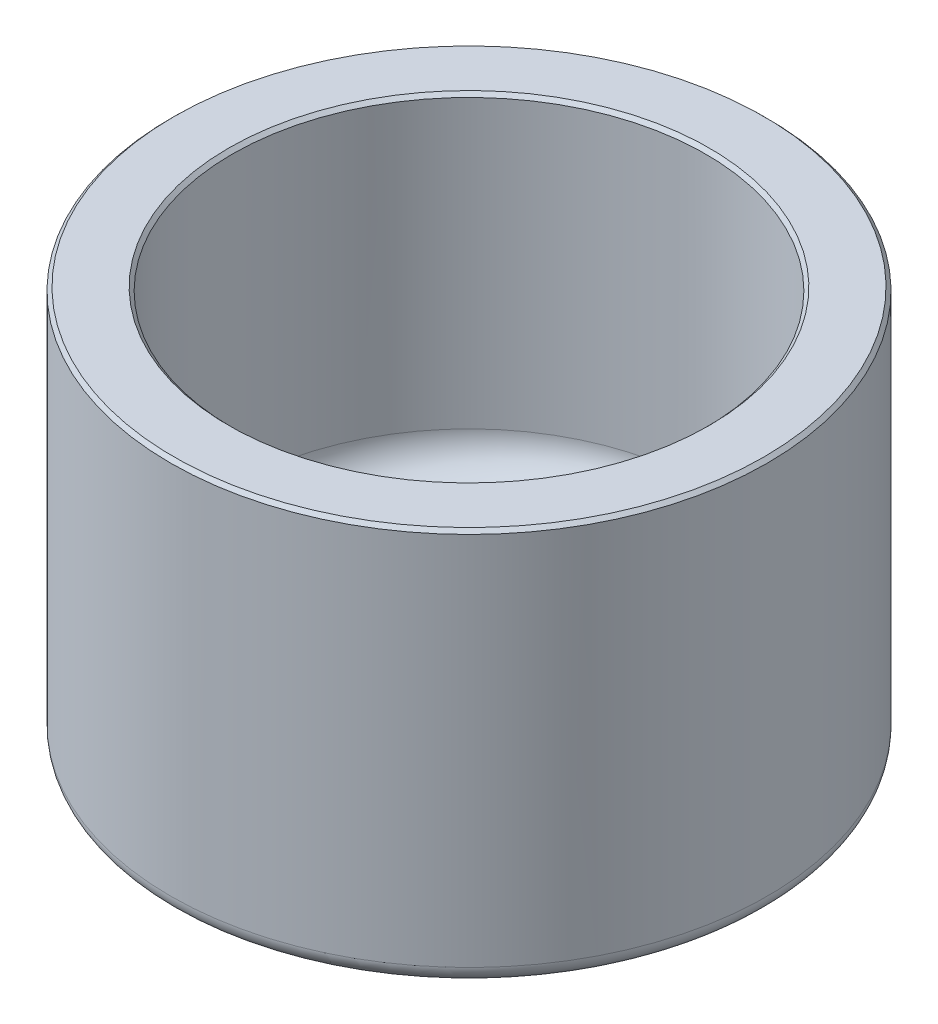
ISO-10303-21;
HEADER;
FILE_DESCRIPTION(('STEP AP214'),'2;1');
FILE_NAME('part.step','',(''),(''),'','','');
FILE_SCHEMA(('AUTOMOTIVE_DESIGN { 1 0 10303 214 1 1 1 1 }'));
ENDSEC;
DATA;
#1=APPLICATION_CONTEXT('core data for automotive mechanical design processes');
#2=APPLICATION_PROTOCOL_DEFINITION('international standard','automotive_design',2000,#1);
#3=PRODUCT_CONTEXT('',#1,'mechanical');
#4=PRODUCT('Part','Part','',(#3));
#5=PRODUCT_RELATED_PRODUCT_CATEGORY('part','',(#4));
#6=PRODUCT_DEFINITION_FORMATION('','',#4);
#7=PRODUCT_DEFINITION_CONTEXT('part definition',#1,'design');
#8=PRODUCT_DEFINITION('design','',#6,#7);
#9=PRODUCT_DEFINITION_SHAPE('','',#8);
#10=(LENGTH_UNIT() NAMED_UNIT(*) SI_UNIT(.MILLI.,.METRE.));
#11=(NAMED_UNIT(*) PLANE_ANGLE_UNIT() SI_UNIT($,.RADIAN.));
#12=(NAMED_UNIT(*) SI_UNIT($,.STERADIAN.) SOLID_ANGLE_UNIT());
#13=UNCERTAINTY_MEASURE_WITH_UNIT(LENGTH_MEASURE(1.E-05),#10,'distance_accuracy_value','');
#14=(GEOMETRIC_REPRESENTATION_CONTEXT(3) GLOBAL_UNCERTAINTY_ASSIGNED_CONTEXT((#13)) GLOBAL_UNIT_ASSIGNED_CONTEXT((#10,
#11,#12)) REPRESENTATION_CONTEXT('',''));
#15=CARTESIAN_POINT('',(0.,0.,0.));
#16=DIRECTION('',(0.,0.,1.));
#17=DIRECTION('',(1.,0.,0.));
#18=AXIS2_PLACEMENT_3D('',#15,#16,#17);
#19=CARTESIAN_POINT('',(-13.45,4.,0.));
#20=DIRECTION('',(0.,1.,0.));
#21=DIRECTION('',(0.,0.,1.));
#22=AXIS2_PLACEMENT_3D('',#19,#20,#21);
#23=PLANE('',#22);
#24=CARTESIAN_POINT('',(0.,4.,0.));
#25=DIRECTION('',(0.,-1.,0.));
#26=DIRECTION('',(0.,0.,-1.));
#27=AXIS2_PLACEMENT_3D('',#24,#25,#26);
#28=CIRCLE('',#27,11.45);
#29=CARTESIAN_POINT('',(0.,4.,11.45));
#30=VERTEX_POINT('',#29);
#31=CARTESIAN_POINT('',(0.,4.,-11.45));
#32=VERTEX_POINT('',#31);
#33=EDGE_CURVE('E48',#30,#32,#28,.F.);
#34=ORIENTED_EDGE('',*,*,#33,.T.);
#35=CARTESIAN_POINT('',(0.,4.,0.));
#36=DIRECTION('',(0.,-1.,0.));
#37=DIRECTION('',(0.,0.,1.));
#38=AXIS2_PLACEMENT_3D('',#35,#36,#37);
#39=CIRCLE('',#38,11.45);
#40=EDGE_CURVE('E45',#32,#30,#39,.F.);
#41=ORIENTED_EDGE('',*,*,#40,.T.);
#42=EDGE_LOOP('',(#34,#41));
#43=FACE_BOUND('',#42,.T.);
#44=ADVANCED_FACE('F17',(#43),#23,.T.);
#45=CARTESIAN_POINT('',(0.,6.,0.));
#46=DIRECTION('',(0.,1.,0.));
#47=DIRECTION('',(0.,0.,1.));
#48=AXIS2_PLACEMENT_3D('',#45,#46,#47);
#49=TOROIDAL_SURFACE('',#48,11.45,2.);
#50=ORIENTED_EDGE('',*,*,#33,.F.);
#51=ORIENTED_EDGE('',*,*,#40,.F.);
#52=EDGE_LOOP('',(#50,#51));
#53=FACE_BOUND('',#52,.T.);
#54=CARTESIAN_POINT('',(0.,6.,0.));
#55=DIRECTION('',(0.,1.,0.));
#56=DIRECTION('',(0.,0.,1.));
#57=AXIS2_PLACEMENT_3D('',#54,#55,#56);
#58=CIRCLE('',#57,13.45);
#59=CARTESIAN_POINT('',(0.,6.,13.45));
#60=VERTEX_POINT('',#59);
#61=EDGE_CURVE('E52',#60,#60,#58,.T.);
#62=ORIENTED_EDGE('',*,*,#61,.T.);
#63=EDGE_LOOP('',(#62));
#64=FACE_BOUND('',#63,.T.);
#65=ADVANCED_FACE('F55',(#53,#64),#49,.F.);
#66=CARTESIAN_POINT('',(0.,4.,0.));
#67=DIRECTION('',(0.,1.,0.));
#68=DIRECTION('',(0.,0.,1.));
#69=AXIS2_PLACEMENT_3D('',#66,#67,#68);
#70=CYLINDRICAL_SURFACE('',#69,13.45);
#71=ORIENTED_EDGE('',*,*,#61,.F.);
#72=EDGE_LOOP('',(#71));
#73=FACE_BOUND('',#72,.T.);
#74=CARTESIAN_POINT('',(0.,22.3,0.));
#75=DIRECTION('',(0.,1.,0.));
#76=DIRECTION('',(0.,0.,1.));
#77=AXIS2_PLACEMENT_3D('',#74,#75,#76);
#78=CIRCLE('',#77,13.45);
#79=CARTESIAN_POINT('',(0.,22.3,13.45));
#80=VERTEX_POINT('',#79);
#81=EDGE_CURVE('E119',#80,#80,#78,.T.);
#82=ORIENTED_EDGE('',*,*,#81,.T.);
#83=EDGE_LOOP('',(#82));
#84=FACE_BOUND('',#83,.T.);
#85=ADVANCED_FACE('F127',(#73,#84),#70,.F.);
#86=CARTESIAN_POINT('',(0.,22.5,0.));
#87=DIRECTION('',(0.,1.,0.));
#88=DIRECTION('',(-1.,0.,0.));
#89=AXIS2_PLACEMENT_3D('',#86,#87,#88);
#90=CONICAL_SURFACE('',#89,13.65,0.785398163397453);
#91=ORIENTED_EDGE('',*,*,#81,.F.);
#92=EDGE_LOOP('',(#91));
#93=FACE_BOUND('',#92,.T.);
#94=CARTESIAN_POINT('',(0.,22.5,0.));
#95=DIRECTION('',(0.,1.,0.));
#96=DIRECTION('',(-1.,0.,0.));
#97=AXIS2_PLACEMENT_3D('',#94,#95,#96);
#98=CIRCLE('',#97,13.65);
#99=CARTESIAN_POINT('',(-13.65,22.5,0.));
#100=VERTEX_POINT('',#99);
#101=EDGE_CURVE('E122',#100,#100,#98,.F.);
#102=ORIENTED_EDGE('',*,*,#101,.F.);
#103=EDGE_LOOP('',(#102));
#104=FACE_BOUND('',#103,.T.);
#105=ADVANCED_FACE('F97',(#93,#104),#90,.F.);
#106=CARTESIAN_POINT('',(0.,0.,0.));
#107=DIRECTION('',(0.,-1.,0.));
#108=DIRECTION('',(0.,0.,-1.));
#109=AXIS2_PLACEMENT_3D('',#106,#107,#108);
#110=PLANE('',#109);
#111=CARTESIAN_POINT('',(0.,0.,0.));
#112=DIRECTION('',(0.,1.,0.));
#113=DIRECTION('',(0.,0.,1.));
#114=AXIS2_PLACEMENT_3D('',#111,#112,#113);
#115=CIRCLE('',#114,15.95);
#116=CARTESIAN_POINT('',(0.,0.,15.95));
#117=VERTEX_POINT('',#116);
#118=CARTESIAN_POINT('',(0.,0.,-15.95));
#119=VERTEX_POINT('',#118);
#120=EDGE_CURVE('E84',#117,#119,#115,.T.);
#121=ORIENTED_EDGE('',*,*,#120,.F.);
#122=CARTESIAN_POINT('',(0.,0.,0.));
#123=DIRECTION('',(0.,1.,0.));
#124=DIRECTION('',(0.,0.,-1.));
#125=AXIS2_PLACEMENT_3D('',#122,#123,#124);
#126=CIRCLE('',#125,15.95);
#127=EDGE_CURVE('E36',#119,#117,#126,.T.);
#128=ORIENTED_EDGE('',*,*,#127,.F.);
#129=EDGE_LOOP('',(#121,#128));
#130=FACE_BOUND('',#129,.T.);
#131=ADVANCED_FACE('F88',(#130),#110,.T.);
#132=CARTESIAN_POINT('',(-16.95,22.5,0.));
#133=DIRECTION('',(0.,1.,0.));
#134=DIRECTION('',(0.,0.,1.));
#135=AXIS2_PLACEMENT_3D('',#132,#133,#134);
#136=PLANE('',#135);
#137=CARTESIAN_POINT('',(0.,22.5,0.));
#138=DIRECTION('',(0.,-1.,0.));
#139=DIRECTION('',(1.,0.,0.));
#140=AXIS2_PLACEMENT_3D('',#137,#138,#139);
#141=CIRCLE('',#140,16.75);
#142=CARTESIAN_POINT('',(16.75,22.5,0.));
#143=VERTEX_POINT('',#142);
#144=EDGE_CURVE('E118',#143,#143,#141,.T.);
#145=ORIENTED_EDGE('',*,*,#144,.F.);
#146=EDGE_LOOP('',(#145));
#147=FACE_BOUND('',#146,.T.);
#148=ORIENTED_EDGE('',*,*,#101,.T.);
#149=EDGE_LOOP('',(#148));
#150=FACE_BOUND('',#149,.T.);
#151=ADVANCED_FACE('F75',(#147,#150),#136,.T.);
#152=CARTESIAN_POINT('',(0.,0.999999999999999,0.));
#153=DIRECTION('',(0.,-1.,0.));
#154=DIRECTION('',(0.,0.,-1.));
#155=AXIS2_PLACEMENT_3D('',#152,#153,#154);
#156=TOROIDAL_SURFACE('',#155,15.95,1.);
#157=ORIENTED_EDGE('',*,*,#127,.T.);
#158=ORIENTED_EDGE('',*,*,#120,.T.);
#159=EDGE_LOOP('',(#157,#158));
#160=FACE_BOUND('',#159,.T.);
#161=CARTESIAN_POINT('',(0.,0.999999999999999,0.));
#162=DIRECTION('',(0.,1.,0.));
#163=DIRECTION('',(0.,0.,1.));
#164=AXIS2_PLACEMENT_3D('',#161,#162,#163);
#165=CIRCLE('',#164,16.95);
#166=CARTESIAN_POINT('',(0.,0.999999999999999,16.95));
#167=VERTEX_POINT('',#166);
#168=EDGE_CURVE('E28',#167,#167,#165,.T.);
#169=ORIENTED_EDGE('',*,*,#168,.F.);
#170=EDGE_LOOP('',(#169));
#171=FACE_BOUND('',#170,.T.);
#172=ADVANCED_FACE('F63',(#160,#171),#156,.T.);
#173=CARTESIAN_POINT('',(0.,22.3,0.));
#174=DIRECTION('',(0.,-1.,0.));
#175=DIRECTION('',(1.,0.,0.));
#176=AXIS2_PLACEMENT_3D('',#173,#174,#175);
#177=CONICAL_SURFACE('',#176,16.95,0.785398163397448);
#178=CARTESIAN_POINT('',(0.,22.3,0.));
#179=DIRECTION('',(0.,1.,0.));
#180=DIRECTION('',(0.,0.,1.));
#181=AXIS2_PLACEMENT_3D('',#178,#179,#180);
#182=CIRCLE('',#181,16.95);
#183=CARTESIAN_POINT('',(0.,22.3,16.95));
#184=VERTEX_POINT('',#183);
#185=EDGE_CURVE('E11',#184,#184,#182,.F.);
#186=ORIENTED_EDGE('',*,*,#185,.F.);
#187=EDGE_LOOP('',(#186));
#188=FACE_BOUND('',#187,.T.);
#189=ORIENTED_EDGE('',*,*,#144,.T.);
#190=EDGE_LOOP('',(#189));
#191=FACE_BOUND('',#190,.T.);
#192=ADVANCED_FACE('F74',(#188,#191),#177,.T.);
#193=CARTESIAN_POINT('',(0.,4.,0.));
#194=DIRECTION('',(0.,1.,0.));
#195=DIRECTION('',(0.,0.,1.));
#196=AXIS2_PLACEMENT_3D('',#193,#194,#195);
#197=CYLINDRICAL_SURFACE('',#196,16.95);
#198=ORIENTED_EDGE('',*,*,#185,.T.);
#199=EDGE_LOOP('',(#198));
#200=FACE_BOUND('',#199,.T.);
#201=ORIENTED_EDGE('',*,*,#168,.T.);
#202=EDGE_LOOP('',(#201));
#203=FACE_BOUND('',#202,.T.);
#204=ADVANCED_FACE('F146',(#200,#203),#197,.T.);
#205=CLOSED_SHELL('',(#44,#65,#85,#105,#131,#151,#172,#192,#204));
#206=MANIFOLD_SOLID_BREP('B1',#205);
#207=ADVANCED_BREP_SHAPE_REPRESENTATION('',(#18,#206),#14);
#208=SHAPE_DEFINITION_REPRESENTATION(#9,#207);
ENDSEC;
END-ISO-10303-21;
